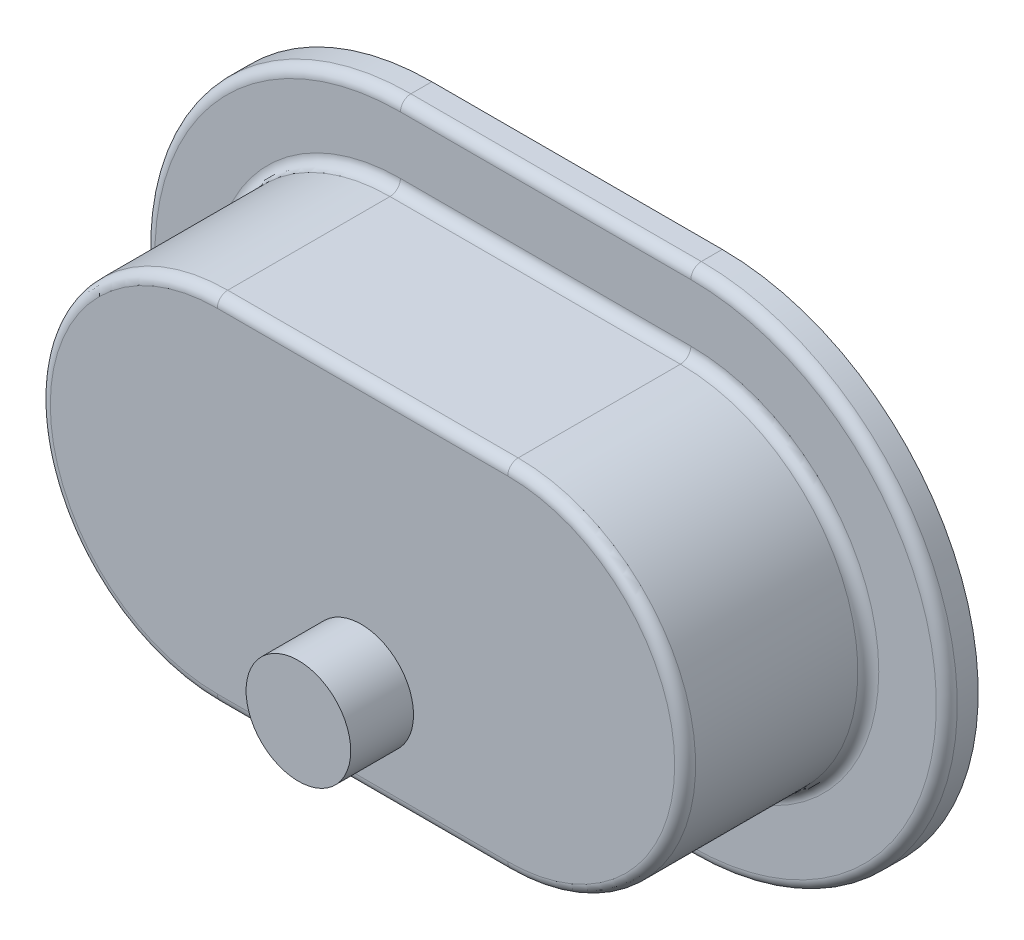
ISO-10303-21;
HEADER;
FILE_DESCRIPTION(('STEP AP214'),'2;1');
FILE_NAME('part.step','',(''),(''),'','','');
FILE_SCHEMA(('AUTOMOTIVE_DESIGN { 1 0 10303 214 1 1 1 1 }'));
ENDSEC;
DATA;
#1=APPLICATION_CONTEXT('core data for automotive mechanical design processes');
#2=APPLICATION_PROTOCOL_DEFINITION('international standard','automotive_design',2000,#1);
#3=PRODUCT_CONTEXT('',#1,'mechanical');
#4=PRODUCT('Part','Part','',(#3));
#5=PRODUCT_RELATED_PRODUCT_CATEGORY('part','',(#4));
#6=PRODUCT_DEFINITION_FORMATION('','',#4);
#7=PRODUCT_DEFINITION_CONTEXT('part definition',#1,'design');
#8=PRODUCT_DEFINITION('design','',#6,#7);
#9=PRODUCT_DEFINITION_SHAPE('','',#8);
#10=(LENGTH_UNIT() NAMED_UNIT(*) SI_UNIT(.MILLI.,.METRE.));
#11=(NAMED_UNIT(*) PLANE_ANGLE_UNIT() SI_UNIT($,.RADIAN.));
#12=(NAMED_UNIT(*) SI_UNIT($,.STERADIAN.) SOLID_ANGLE_UNIT());
#13=UNCERTAINTY_MEASURE_WITH_UNIT(LENGTH_MEASURE(1.E-05),#10,'distance_accuracy_value','');
#14=(GEOMETRIC_REPRESENTATION_CONTEXT(3) GLOBAL_UNCERTAINTY_ASSIGNED_CONTEXT((#13)) GLOBAL_UNIT_ASSIGNED_CONTEXT((#10,
#11,#12)) REPRESENTATION_CONTEXT('',''));
#15=CARTESIAN_POINT('',(0.,0.,0.));
#16=DIRECTION('',(0.,0.,1.));
#17=DIRECTION('',(1.,0.,0.));
#18=AXIS2_PLACEMENT_3D('',#15,#16,#17);
#19=CARTESIAN_POINT('',(-27.4999999999999,90.5,6.));
#20=DIRECTION('',(0.,0.,-1.));
#21=DIRECTION('',(-1.,0.,0.));
#22=AXIS2_PLACEMENT_3D('',#19,#20,#21);
#23=CYLINDRICAL_SURFACE('',#22,48.9085956407228);
#24=DIRECTION('',(0.,0.,-1.));
#25=VECTOR('',#24,1.);
#26=CARTESIAN_POINT('',(-27.4999999999999,41.5914043592772,6.));
#27=LINE('',#26,#25);
#28=CARTESIAN_POINT('',(-27.4999999999999,41.5914043592772,4.));
#29=VERTEX_POINT('',#28);
#30=CARTESIAN_POINT('',(-27.4999999999999,41.5914043592772,0.));
#31=VERTEX_POINT('',#30);
#32=EDGE_CURVE('E371',#29,#31,#27,.T.);
#33=ORIENTED_EDGE('',*,*,#32,.F.);
#34=CARTESIAN_POINT('',(-27.4999999999999,90.5,4.));
#35=DIRECTION('',(0.,0.,1.));
#36=DIRECTION('',(1.,0.,0.));
#37=AXIS2_PLACEMENT_3D('',#34,#35,#36);
#38=CIRCLE('',#37,48.9085956407228);
#39=CARTESIAN_POINT('',(-27.4999999999999,139.408595640723,4.));
#40=VERTEX_POINT('',#39);
#41=EDGE_CURVE('E424',#29,#40,#38,.F.);
#42=ORIENTED_EDGE('',*,*,#41,.T.);
#43=DIRECTION('',(0.,0.,-1.));
#44=VECTOR('',#43,1.);
#45=CARTESIAN_POINT('',(-27.4999999999999,139.408595640723,6.));
#46=LINE('',#45,#44);
#47=CARTESIAN_POINT('',(-27.4999999999999,139.408595640723,0.));
#48=VERTEX_POINT('',#47);
#49=EDGE_CURVE('E362',#40,#48,#46,.T.);
#50=ORIENTED_EDGE('',*,*,#49,.T.);
#51=CARTESIAN_POINT('',(-27.4999999999999,90.5,0.));
#52=DIRECTION('',(0.,0.,1.));
#53=DIRECTION('',(1.,0.,0.));
#54=AXIS2_PLACEMENT_3D('',#51,#52,#53);
#55=CIRCLE('',#54,48.9085956407228);
#56=EDGE_CURVE('E346',#48,#31,#55,.T.);
#57=ORIENTED_EDGE('',*,*,#56,.T.);
#58=EDGE_LOOP('',(#33,#42,#50,#57));
#59=FACE_BOUND('',#58,.T.);
#60=ADVANCED_FACE('F39',(#59),#23,.T.);
#61=CARTESIAN_POINT('',(-27.4999999999999,41.5914043592772,6.));
#62=DIRECTION('',(0.,1.,0.));
#63=DIRECTION('',(-1.,0.,0.));
#64=AXIS2_PLACEMENT_3D('',#61,#62,#63);
#65=PLANE('',#64);
#66=DIRECTION('',(0.,0.,-1.));
#67=VECTOR('',#66,1.);
#68=CARTESIAN_POINT('',(27.9999999999998,41.5914043592773,6.));
#69=LINE('',#68,#67);
#70=CARTESIAN_POINT('',(27.9999999999998,41.5914043592773,4.));
#71=VERTEX_POINT('',#70);
#72=CARTESIAN_POINT('',(27.9999999999998,41.5914043592773,0.));
#73=VERTEX_POINT('',#72);
#74=EDGE_CURVE('E368',#71,#73,#69,.T.);
#75=ORIENTED_EDGE('',*,*,#74,.F.);
#76=DIRECTION('',(1.,0.,0.));
#77=VECTOR('',#76,1.);
#78=CARTESIAN_POINT('',(-27.4999999999999,41.5914043592772,4.));
#79=LINE('',#78,#77);
#80=EDGE_CURVE('E420',#71,#29,#79,.F.);
#81=ORIENTED_EDGE('',*,*,#80,.T.);
#82=ORIENTED_EDGE('',*,*,#32,.T.);
#83=DIRECTION('',(1.,0.,0.));
#84=VECTOR('',#83,1.);
#85=CARTESIAN_POINT('',(-27.4999999999999,41.5914043592772,0.));
#86=LINE('',#85,#84);
#87=EDGE_CURVE('E350',#31,#73,#86,.T.);
#88=ORIENTED_EDGE('',*,*,#87,.T.);
#89=EDGE_LOOP('',(#75,#81,#82,#88));
#90=FACE_BOUND('',#89,.T.);
#91=ADVANCED_FACE('F545',(#90),#65,.F.);
#92=CARTESIAN_POINT('',(27.9999999999998,90.5000000000001,6.));
#93=DIRECTION('',(0.,0.,-1.));
#94=DIRECTION('',(-1.,0.,0.));
#95=AXIS2_PLACEMENT_3D('',#92,#93,#94);
#96=CYLINDRICAL_SURFACE('',#95,48.9085956407228);
#97=DIRECTION('',(0.,0.,-1.));
#98=VECTOR('',#97,1.);
#99=CARTESIAN_POINT('',(27.9999999999998,139.408595640723,6.));
#100=LINE('',#99,#98);
#101=CARTESIAN_POINT('',(27.9999999999998,139.408595640723,4.));
#102=VERTEX_POINT('',#101);
#103=CARTESIAN_POINT('',(27.9999999999998,139.408595640723,0.));
#104=VERTEX_POINT('',#103);
#105=EDGE_CURVE('E365',#102,#104,#100,.T.);
#106=ORIENTED_EDGE('',*,*,#105,.F.);
#107=CARTESIAN_POINT('',(27.9999999999998,90.5000000000001,4.));
#108=DIRECTION('',(0.,0.,1.));
#109=DIRECTION('',(1.,0.,0.));
#110=AXIS2_PLACEMENT_3D('',#107,#108,#109);
#111=CIRCLE('',#110,48.9085956407228);
#112=EDGE_CURVE('E11',#102,#71,#111,.F.);
#113=ORIENTED_EDGE('',*,*,#112,.T.);
#114=ORIENTED_EDGE('',*,*,#74,.T.);
#115=CARTESIAN_POINT('',(27.9999999999998,90.5000000000001,0.));
#116=DIRECTION('',(0.,0.,1.));
#117=DIRECTION('',(1.,0.,0.));
#118=AXIS2_PLACEMENT_3D('',#115,#116,#117);
#119=CIRCLE('',#118,48.9085956407228);
#120=EDGE_CURVE('E354',#73,#104,#119,.T.);
#121=ORIENTED_EDGE('',*,*,#120,.T.);
#122=EDGE_LOOP('',(#106,#113,#114,#121));
#123=FACE_BOUND('',#122,.T.);
#124=ADVANCED_FACE('F551',(#123),#96,.T.);
#125=CARTESIAN_POINT('',(-27.4999999999999,139.408595640723,6.));
#126=DIRECTION('',(0.,-1.,0.));
#127=DIRECTION('',(0.,0.,-1.));
#128=AXIS2_PLACEMENT_3D('',#125,#126,#127);
#129=PLANE('',#128);
#130=ORIENTED_EDGE('',*,*,#49,.F.);
#131=DIRECTION('',(-1.,0.,0.));
#132=VECTOR('',#131,1.);
#133=CARTESIAN_POINT('',(27.9999999999998,139.408595640723,4.));
#134=LINE('',#133,#132);
#135=EDGE_CURVE('E427',#40,#102,#134,.F.);
#136=ORIENTED_EDGE('',*,*,#135,.T.);
#137=ORIENTED_EDGE('',*,*,#105,.T.);
#138=DIRECTION('',(-1.,0.,0.));
#139=VECTOR('',#138,1.);
#140=CARTESIAN_POINT('',(-27.4999999999999,139.408595640723,0.));
#141=LINE('',#140,#139);
#142=EDGE_CURVE('E358',#104,#48,#141,.T.);
#143=ORIENTED_EDGE('',*,*,#142,.T.);
#144=EDGE_LOOP('',(#130,#136,#137,#143));
#145=FACE_BOUND('',#144,.T.);
#146=ADVANCED_FACE('F646',(#145),#129,.F.);
#147=CARTESIAN_POINT('',(-27.4999999999999,90.5,6.));
#148=DIRECTION('',(0.,0.,1.));
#149=DIRECTION('',(1.,0.,0.));
#150=AXIS2_PLACEMENT_3D('',#147,#148,#149);
#151=PLANE('',#150);
#152=DIRECTION('',(-1.,0.,0.));
#153=VECTOR('',#152,1.);
#154=CARTESIAN_POINT('',(-27.4999999999999,126.408595640723,6.));
#155=LINE('',#154,#153);
#156=CARTESIAN_POINT('',(-27.4999999999999,126.408595640723,6.));
#157=VERTEX_POINT('',#156);
#158=CARTESIAN_POINT('',(27.9999999999998,126.408595640723,6.));
#159=VERTEX_POINT('',#158);
#160=EDGE_CURVE('E394',#157,#159,#155,.F.);
#161=ORIENTED_EDGE('',*,*,#160,.T.);
#162=CARTESIAN_POINT('',(27.9999999999998,90.5000000000001,6.));
#163=DIRECTION('',(0.,0.,1.));
#164=DIRECTION('',(1.,0.,0.));
#165=AXIS2_PLACEMENT_3D('',#162,#163,#164);
#166=CIRCLE('',#165,35.9085956407228);
#167=CARTESIAN_POINT('',(27.9999999999997,54.5914043592773,6.));
#168=VERTEX_POINT('',#167);
#169=EDGE_CURVE('E403',#159,#168,#166,.F.);
#170=ORIENTED_EDGE('',*,*,#169,.T.);
#171=DIRECTION('',(1.,0.,0.));
#172=VECTOR('',#171,1.);
#173=CARTESIAN_POINT('',(-27.4999999999998,54.5914043592772,6.));
#174=LINE('',#173,#172);
#175=CARTESIAN_POINT('',(-27.4999999999999,54.5914043592772,6.));
#176=VERTEX_POINT('',#175);
#177=EDGE_CURVE('E400',#168,#176,#174,.F.);
#178=ORIENTED_EDGE('',*,*,#177,.T.);
#179=CARTESIAN_POINT('',(-27.4999999999999,90.5,6.));
#180=DIRECTION('',(0.,0.,1.));
#181=DIRECTION('',(1.,0.,0.));
#182=AXIS2_PLACEMENT_3D('',#179,#180,#181);
#183=CIRCLE('',#182,35.9085956407228);
#184=EDGE_CURVE('E397',#176,#157,#183,.F.);
#185=ORIENTED_EDGE('',*,*,#184,.T.);
#186=EDGE_LOOP('',(#161,#170,#178,#185));
#187=FACE_BOUND('',#186,.T.);
#188=CARTESIAN_POINT('',(-27.4999999999999,90.5,6.));
#189=DIRECTION('',(0.,0.,1.));
#190=DIRECTION('',(1.,0.,0.));
#191=AXIS2_PLACEMENT_3D('',#188,#189,#190);
#192=CIRCLE('',#191,46.9085956407228);
#193=CARTESIAN_POINT('',(-27.4999999999999,137.408595640723,6.));
#194=VERTEX_POINT('',#193);
#195=CARTESIAN_POINT('',(-27.4999999999999,43.5914043592772,6.));
#196=VERTEX_POINT('',#195);
#197=EDGE_CURVE('E387',#194,#196,#192,.T.);
#198=ORIENTED_EDGE('',*,*,#197,.T.);
#199=DIRECTION('',(1.,0.,0.));
#200=VECTOR('',#199,1.);
#201=CARTESIAN_POINT('',(27.9999999999998,43.5914043592773,6.));
#202=LINE('',#201,#200);
#203=CARTESIAN_POINT('',(27.9999999999998,43.5914043592773,6.));
#204=VERTEX_POINT('',#203);
#205=EDGE_CURVE('E390',#196,#204,#202,.T.);
#206=ORIENTED_EDGE('',*,*,#205,.T.);
#207=CARTESIAN_POINT('',(27.9999999999998,90.5000000000001,6.));
#208=DIRECTION('',(0.,0.,1.));
#209=DIRECTION('',(1.,0.,0.));
#210=AXIS2_PLACEMENT_3D('',#207,#208,#209);
#211=CIRCLE('',#210,46.9085956407228);
#212=CARTESIAN_POINT('',(27.9999999999998,137.408595640723,6.));
#213=VERTEX_POINT('',#212);
#214=EDGE_CURVE('E381',#204,#213,#211,.T.);
#215=ORIENTED_EDGE('',*,*,#214,.T.);
#216=DIRECTION('',(-1.,0.,0.));
#217=VECTOR('',#216,1.);
#218=CARTESIAN_POINT('',(-27.4999999999999,137.408595640723,6.));
#219=LINE('',#218,#217);
#220=EDGE_CURVE('E384',#213,#194,#219,.T.);
#221=ORIENTED_EDGE('',*,*,#220,.T.);
#222=EDGE_LOOP('',(#198,#206,#215,#221));
#223=FACE_BOUND('',#222,.T.);
#224=ADVANCED_FACE('F639',(#187,#223),#151,.T.);
#225=CARTESIAN_POINT('',(-27.4999999999999,90.5,0.));
#226=DIRECTION('',(0.,0.,1.));
#227=DIRECTION('',(1.,0.,0.));
#228=AXIS2_PLACEMENT_3D('',#225,#226,#227);
#229=PLANE('',#228);
#230=DIRECTION('',(-1.,0.,0.));
#231=VECTOR('',#230,1.);
#232=CARTESIAN_POINT('',(-27.4999999999999,137.408595640723,0.));
#233=LINE('',#232,#231);
#234=CARTESIAN_POINT('',(27.9999999999998,137.408595640723,0.));
#235=VERTEX_POINT('',#234);
#236=CARTESIAN_POINT('',(-27.4999999999999,137.408595640723,0.));
#237=VERTEX_POINT('',#236);
#238=EDGE_CURVE('E243',#235,#237,#233,.T.);
#239=ORIENTED_EDGE('',*,*,#238,.T.);
#240=CARTESIAN_POINT('',(-27.4999999999999,90.5,0.));
#241=DIRECTION('',(0.,0.,1.));
#242=DIRECTION('',(1.,0.,0.));
#243=AXIS2_PLACEMENT_3D('',#240,#241,#242);
#244=CIRCLE('',#243,46.9085956407228);
#245=CARTESIAN_POINT('',(-27.4999999999999,43.5914043592772,0.));
#246=VERTEX_POINT('',#245);
#247=EDGE_CURVE('E284',#237,#246,#244,.T.);
#248=ORIENTED_EDGE('',*,*,#247,.T.);
#249=DIRECTION('',(1.,0.,0.));
#250=VECTOR('',#249,1.);
#251=CARTESIAN_POINT('',(-27.4999999999999,43.5914043592772,0.));
#252=LINE('',#251,#250);
#253=CARTESIAN_POINT('',(27.9999999999998,43.5914043592773,0.));
#254=VERTEX_POINT('',#253);
#255=EDGE_CURVE('E209',#246,#254,#252,.T.);
#256=ORIENTED_EDGE('',*,*,#255,.T.);
#257=CARTESIAN_POINT('',(27.9999999999998,90.5000000000001,0.));
#258=DIRECTION('',(0.,0.,1.));
#259=DIRECTION('',(1.,0.,0.));
#260=AXIS2_PLACEMENT_3D('',#257,#258,#259);
#261=CIRCLE('',#260,46.9085956407228);
#262=EDGE_CURVE('E57',#254,#235,#261,.T.);
#263=ORIENTED_EDGE('',*,*,#262,.T.);
#264=EDGE_LOOP('',(#239,#248,#256,#263));
#265=FACE_BOUND('',#264,.T.);
#266=ORIENTED_EDGE('',*,*,#56,.F.);
#267=ORIENTED_EDGE('',*,*,#142,.F.);
#268=ORIENTED_EDGE('',*,*,#120,.F.);
#269=ORIENTED_EDGE('',*,*,#87,.F.);
#270=EDGE_LOOP('',(#266,#267,#268,#269));
#271=FACE_BOUND('',#270,.T.);
#272=ADVANCED_FACE('F633',(#265,#271),#229,.F.);
#273=CARTESIAN_POINT('',(-27.4999999999999,90.5,41.));
#274=DIRECTION('',(0.,0.,-1.));
#275=DIRECTION('',(-1.,0.,0.));
#276=AXIS2_PLACEMENT_3D('',#273,#274,#275);
#277=CYLINDRICAL_SURFACE('',#276,33.9085956407228);
#278=DIRECTION('',(0.,0.,-1.));
#279=VECTOR('',#278,1.);
#280=CARTESIAN_POINT('',(-27.4999999999999,124.408595640723,41.));
#281=LINE('',#280,#279);
#282=CARTESIAN_POINT('',(-27.4999999999999,124.408595640723,39.));
#283=VERTEX_POINT('',#282);
#284=CARTESIAN_POINT('',(-27.4999999999999,124.408595640723,8.));
#285=VERTEX_POINT('',#284);
#286=EDGE_CURVE('E329',#283,#285,#281,.T.);
#287=ORIENTED_EDGE('',*,*,#286,.T.);
#288=CARTESIAN_POINT('',(-27.4999999999999,90.5,8.));
#289=DIRECTION('',(0.,0.,1.));
#290=DIRECTION('',(1.,0.,0.));
#291=AXIS2_PLACEMENT_3D('',#288,#289,#290);
#292=CIRCLE('',#291,33.9085956407228);
#293=CARTESIAN_POINT('',(-27.4999999999999,56.5914043592772,8.));
#294=VERTEX_POINT('',#293);
#295=EDGE_CURVE('E417',#285,#294,#292,.T.);
#296=ORIENTED_EDGE('',*,*,#295,.T.);
#297=DIRECTION('',(0.,0.,-1.));
#298=VECTOR('',#297,1.);
#299=CARTESIAN_POINT('',(-27.4999999999999,56.5914043592772,41.));
#300=LINE('',#299,#298);
#301=CARTESIAN_POINT('',(-27.4999999999999,56.5914043592772,39.));
#302=VERTEX_POINT('',#301);
#303=EDGE_CURVE('E342',#302,#294,#300,.T.);
#304=ORIENTED_EDGE('',*,*,#303,.F.);
#305=CARTESIAN_POINT('',(-27.4999999999999,90.5,39.));
#306=DIRECTION('',(0.,0.,1.));
#307=DIRECTION('',(1.,0.,0.));
#308=AXIS2_PLACEMENT_3D('',#305,#306,#307);
#309=CIRCLE('',#308,33.9085956407228);
#310=EDGE_CURVE('E414',#302,#283,#309,.F.);
#311=ORIENTED_EDGE('',*,*,#310,.T.);
#312=EDGE_LOOP('',(#287,#296,#304,#311));
#313=FACE_BOUND('',#312,.T.);
#314=ADVANCED_FACE('F513',(#313),#277,.T.);
#315=CARTESIAN_POINT('',(-27.4999999999999,56.5914043592772,41.));
#316=DIRECTION('',(0.,1.,0.));
#317=DIRECTION('',(-1.,0.,0.));
#318=AXIS2_PLACEMENT_3D('',#315,#316,#317);
#319=PLANE('',#318);
#320=ORIENTED_EDGE('',*,*,#303,.T.);
#321=DIRECTION('',(1.,0.,0.));
#322=VECTOR('',#321,1.);
#323=CARTESIAN_POINT('',(-27.4999999999999,56.5914043592772,8.));
#324=LINE('',#323,#322);
#325=CARTESIAN_POINT('',(27.9999999999997,56.5914043592773,8.));
#326=VERTEX_POINT('',#325);
#327=EDGE_CURVE('E411',#294,#326,#324,.T.);
#328=ORIENTED_EDGE('',*,*,#327,.T.);
#329=DIRECTION('',(0.,0.,-1.));
#330=VECTOR('',#329,1.);
#331=CARTESIAN_POINT('',(27.9999999999997,56.5914043592773,41.));
#332=LINE('',#331,#330);
#333=CARTESIAN_POINT('',(27.9999999999997,56.5914043592773,39.));
#334=VERTEX_POINT('',#333);
#335=EDGE_CURVE('E338',#334,#326,#332,.T.);
#336=ORIENTED_EDGE('',*,*,#335,.F.);
#337=DIRECTION('',(1.,0.,0.));
#338=VECTOR('',#337,1.);
#339=CARTESIAN_POINT('',(-27.4999999999999,56.5914043592772,39.));
#340=LINE('',#339,#338);
#341=EDGE_CURVE('E407',#334,#302,#340,.F.);
#342=ORIENTED_EDGE('',*,*,#341,.T.);
#343=EDGE_LOOP('',(#320,#328,#336,#342));
#344=FACE_BOUND('',#343,.T.);
#345=ADVANCED_FACE('F523',(#344),#319,.F.);
#346=CARTESIAN_POINT('',(27.9999999999998,90.5000000000001,41.));
#347=DIRECTION('',(0.,0.,-1.));
#348=DIRECTION('',(-1.,0.,0.));
#349=AXIS2_PLACEMENT_3D('',#346,#347,#348);
#350=CYLINDRICAL_SURFACE('',#349,33.9085956407228);
#351=ORIENTED_EDGE('',*,*,#335,.T.);
#352=CARTESIAN_POINT('',(27.9999999999998,90.5000000000001,8.));
#353=DIRECTION('',(0.,0.,1.));
#354=DIRECTION('',(1.,0.,0.));
#355=AXIS2_PLACEMENT_3D('',#352,#353,#354);
#356=CIRCLE('',#355,33.9085956407228);
#357=CARTESIAN_POINT('',(27.9999999999998,124.408595640723,8.));
#358=VERTEX_POINT('',#357);
#359=EDGE_CURVE('E377',#326,#358,#356,.T.);
#360=ORIENTED_EDGE('',*,*,#359,.T.);
#361=DIRECTION('',(0.,0.,-1.));
#362=VECTOR('',#361,1.);
#363=CARTESIAN_POINT('',(27.9999999999998,124.408595640723,41.));
#364=LINE('',#363,#362);
#365=CARTESIAN_POINT('',(27.9999999999998,124.408595640723,39.));
#366=VERTEX_POINT('',#365);
#367=EDGE_CURVE('E333',#366,#358,#364,.T.);
#368=ORIENTED_EDGE('',*,*,#367,.F.);
#369=CARTESIAN_POINT('',(27.9999999999998,90.5000000000001,39.));
#370=DIRECTION('',(0.,0.,1.));
#371=DIRECTION('',(1.,0.,0.));
#372=AXIS2_PLACEMENT_3D('',#369,#370,#371);
#373=CIRCLE('',#372,33.9085956407228);
#374=EDGE_CURVE('E374',#366,#334,#373,.F.);
#375=ORIENTED_EDGE('',*,*,#374,.T.);
#376=EDGE_LOOP('',(#351,#360,#368,#375));
#377=FACE_BOUND('',#376,.T.);
#378=ADVANCED_FACE('F497',(#377),#350,.T.);
#379=CARTESIAN_POINT('',(27.9999999999998,124.408595640723,41.));
#380=DIRECTION('',(0.,-1.,0.));
#381=DIRECTION('',(0.,0.,-1.));
#382=AXIS2_PLACEMENT_3D('',#379,#380,#381);
#383=PLANE('',#382);
#384=ORIENTED_EDGE('',*,*,#286,.F.);
#385=DIRECTION('',(-1.,0.,0.));
#386=VECTOR('',#385,1.);
#387=CARTESIAN_POINT('',(27.9999999999998,124.408595640723,39.));
#388=LINE('',#387,#386);
#389=EDGE_CURVE('E49',#283,#366,#388,.F.);
#390=ORIENTED_EDGE('',*,*,#389,.T.);
#391=ORIENTED_EDGE('',*,*,#367,.T.);
#392=DIRECTION('',(-1.,0.,0.));
#393=VECTOR('',#392,1.);
#394=CARTESIAN_POINT('',(27.9999999999998,124.408595640723,8.));
#395=LINE('',#394,#393);
#396=EDGE_CURVE('E440',#358,#285,#395,.T.);
#397=ORIENTED_EDGE('',*,*,#396,.T.);
#398=EDGE_LOOP('',(#384,#390,#391,#397));
#399=FACE_BOUND('',#398,.T.);
#400=ADVANCED_FACE('F495',(#399),#383,.F.);
#401=CARTESIAN_POINT('',(-27.4999999999999,90.5,41.));
#402=DIRECTION('',(0.,0.,1.));
#403=DIRECTION('',(1.,0.,0.));
#404=AXIS2_PLACEMENT_3D('',#401,#402,#403);
#405=PLANE('',#404);
#406=CARTESIAN_POINT('',(0.,73.8826492690237,41.));
#407=DIRECTION('',(0.,0.,1.));
#408=DIRECTION('',(1.,0.,0.));
#409=AXIS2_PLACEMENT_3D('',#406,#407,#408);
#410=CIRCLE('',#409,10.);
#411=CARTESIAN_POINT('',(10.,73.8826492690237,41.));
#412=VERTEX_POINT('',#411);
#413=EDGE_CURVE('E928',#412,#412,#410,.T.);
#414=ORIENTED_EDGE('',*,*,#413,.F.);
#415=EDGE_LOOP('',(#414));
#416=FACE_BOUND('',#415,.T.);
#417=CARTESIAN_POINT('',(-27.4999999999999,90.5,41.));
#418=DIRECTION('',(0.,0.,1.));
#419=DIRECTION('',(1.,0.,0.));
#420=AXIS2_PLACEMENT_3D('',#417,#418,#419);
#421=CIRCLE('',#420,31.9085956407228);
#422=CARTESIAN_POINT('',(-27.4999999999999,122.408595640723,41.));
#423=VERTEX_POINT('',#422);
#424=CARTESIAN_POINT('',(-27.4999999999999,58.5914043592772,41.));
#425=VERTEX_POINT('',#424);
#426=EDGE_CURVE('E65',#423,#425,#421,.T.);
#427=ORIENTED_EDGE('',*,*,#426,.T.);
#428=DIRECTION('',(1.,0.,0.));
#429=VECTOR('',#428,1.);
#430=CARTESIAN_POINT('',(27.9999999999997,58.5914043592773,41.));
#431=LINE('',#430,#429);
#432=CARTESIAN_POINT('',(27.9999999999997,58.5914043592773,41.));
#433=VERTEX_POINT('',#432);
#434=EDGE_CURVE('E438',#425,#433,#431,.T.);
#435=ORIENTED_EDGE('',*,*,#434,.T.);
#436=CARTESIAN_POINT('',(27.9999999999998,90.5000000000001,41.));
#437=DIRECTION('',(0.,0.,1.));
#438=DIRECTION('',(1.,0.,0.));
#439=AXIS2_PLACEMENT_3D('',#436,#437,#438);
#440=CIRCLE('',#439,31.9085956407228);
#441=CARTESIAN_POINT('',(27.9999999999998,122.408595640723,41.));
#442=VERTEX_POINT('',#441);
#443=EDGE_CURVE('E430',#433,#442,#440,.T.);
#444=ORIENTED_EDGE('',*,*,#443,.T.);
#445=DIRECTION('',(-1.,0.,0.));
#446=VECTOR('',#445,1.);
#447=CARTESIAN_POINT('',(-27.4999999999999,122.408595640723,41.));
#448=LINE('',#447,#446);
#449=EDGE_CURVE('E433',#442,#423,#448,.T.);
#450=ORIENTED_EDGE('',*,*,#449,.T.);
#451=EDGE_LOOP('',(#427,#435,#444,#450));
#452=FACE_BOUND('',#451,.T.);
#453=ADVANCED_FACE('F530',(#416,#452),#405,.T.);
#454=CARTESIAN_POINT('',(-27.4999999999999,90.5,8.));
#455=DIRECTION('',(0.,0.,1.));
#456=DIRECTION('',(1.,0.,0.));
#457=AXIS2_PLACEMENT_3D('',#454,#455,#456);
#458=TOROIDAL_SURFACE('',#457,35.9085956407228,2.);
#459=CARTESIAN_POINT('',(-27.4999999999999,126.408595640723,8.));
#460=DIRECTION('',(-1.,0.,0.));
#461=DIRECTION('',(0.,0.,1.));
#462=AXIS2_PLACEMENT_3D('',#459,#460,#461);
#463=CIRCLE('',#462,2.);
#464=EDGE_CURVE('E452',#157,#285,#463,.T.);
#465=ORIENTED_EDGE('',*,*,#464,.F.);
#466=ORIENTED_EDGE('',*,*,#184,.F.);
#467=CARTESIAN_POINT('',(-27.4999999999999,54.5914043592772,8.));
#468=DIRECTION('',(-1.,0.,0.));
#469=DIRECTION('',(0.,0.,1.));
#470=AXIS2_PLACEMENT_3D('',#467,#468,#469);
#471=CIRCLE('',#470,2.);
#472=EDGE_CURVE('E334',#294,#176,#471,.T.);
#473=ORIENTED_EDGE('',*,*,#472,.F.);
#474=ORIENTED_EDGE('',*,*,#295,.F.);
#475=EDGE_LOOP('',(#465,#466,#473,#474));
#476=FACE_BOUND('',#475,.T.);
#477=ADVANCED_FACE('F517',(#476),#458,.F.);
#478=CARTESIAN_POINT('',(-27.4999999999999,54.5914043592772,8.));
#479=DIRECTION('',(1.,0.,0.));
#480=DIRECTION('',(0.,1.,0.));
#481=AXIS2_PLACEMENT_3D('',#478,#479,#480);
#482=CYLINDRICAL_SURFACE('',#481,2.);
#483=ORIENTED_EDGE('',*,*,#472,.T.);
#484=ORIENTED_EDGE('',*,*,#177,.F.);
#485=CARTESIAN_POINT('',(27.9999999999998,54.5914043592773,8.));
#486=DIRECTION('',(-1.,0.,0.));
#487=DIRECTION('',(0.,0.,1.));
#488=AXIS2_PLACEMENT_3D('',#485,#486,#487);
#489=CIRCLE('',#488,2.);
#490=EDGE_CURVE('E448',#326,#168,#489,.T.);
#491=ORIENTED_EDGE('',*,*,#490,.F.);
#492=ORIENTED_EDGE('',*,*,#327,.F.);
#493=EDGE_LOOP('',(#483,#484,#491,#492));
#494=FACE_BOUND('',#493,.T.);
#495=ADVANCED_FACE('F521',(#494),#482,.F.);
#496=CARTESIAN_POINT('',(27.9999999999998,126.408595640723,8.));
#497=DIRECTION('',(-1.,0.,0.));
#498=DIRECTION('',(0.,0.,1.));
#499=AXIS2_PLACEMENT_3D('',#496,#497,#498);
#500=CYLINDRICAL_SURFACE('',#499,2.);
#501=ORIENTED_EDGE('',*,*,#464,.T.);
#502=ORIENTED_EDGE('',*,*,#396,.F.);
#503=CARTESIAN_POINT('',(27.9999999999998,126.408595640723,8.));
#504=DIRECTION('',(-1.,0.,0.));
#505=DIRECTION('',(0.,0.,1.));
#506=AXIS2_PLACEMENT_3D('',#503,#504,#505);
#507=CIRCLE('',#506,2.);
#508=EDGE_CURVE('E445',#159,#358,#507,.T.);
#509=ORIENTED_EDGE('',*,*,#508,.F.);
#510=ORIENTED_EDGE('',*,*,#160,.F.);
#511=EDGE_LOOP('',(#501,#502,#509,#510));
#512=FACE_BOUND('',#511,.T.);
#513=ADVANCED_FACE('F509',(#512),#500,.F.);
#514=CARTESIAN_POINT('',(27.9999999999998,90.5000000000001,8.));
#515=DIRECTION('',(0.,0.,1.));
#516=DIRECTION('',(1.,0.,0.));
#517=AXIS2_PLACEMENT_3D('',#514,#515,#516);
#518=TOROIDAL_SURFACE('',#517,35.9085956407228,2.);
#519=ORIENTED_EDGE('',*,*,#490,.T.);
#520=ORIENTED_EDGE('',*,*,#169,.F.);
#521=ORIENTED_EDGE('',*,*,#508,.T.);
#522=ORIENTED_EDGE('',*,*,#359,.F.);
#523=EDGE_LOOP('',(#519,#520,#521,#522));
#524=FACE_BOUND('',#523,.T.);
#525=ADVANCED_FACE('F502',(#524),#518,.F.);
#526=CARTESIAN_POINT('',(-27.4999999999999,137.408595640723,4.));
#527=DIRECTION('',(1.,0.,0.));
#528=DIRECTION('',(0.,0.,-1.));
#529=AXIS2_PLACEMENT_3D('',#526,#527,#528);
#530=CYLINDRICAL_SURFACE('',#529,2.);
#531=CARTESIAN_POINT('',(27.9999999999998,137.408595640723,4.));
#532=DIRECTION('',(1.,0.,0.));
#533=DIRECTION('',(0.,0.,-1.));
#534=AXIS2_PLACEMENT_3D('',#531,#532,#533);
#535=CIRCLE('',#534,2.);
#536=EDGE_CURVE('E465',#102,#213,#535,.T.);
#537=ORIENTED_EDGE('',*,*,#536,.F.);
#538=ORIENTED_EDGE('',*,*,#135,.F.);
#539=CARTESIAN_POINT('',(-27.4999999999999,137.408595640723,4.));
#540=DIRECTION('',(-1.,0.,0.));
#541=DIRECTION('',(0.,0.,1.));
#542=AXIS2_PLACEMENT_3D('',#539,#540,#541);
#543=CIRCLE('',#542,2.);
#544=EDGE_CURVE('E449',#194,#40,#543,.T.);
#545=ORIENTED_EDGE('',*,*,#544,.F.);
#546=ORIENTED_EDGE('',*,*,#220,.F.);
#547=EDGE_LOOP('',(#537,#538,#545,#546));
#548=FACE_BOUND('',#547,.T.);
#549=ADVANCED_FACE('F559',(#548),#530,.T.);
#550=CARTESIAN_POINT('',(-27.4999999999999,90.5,4.));
#551=DIRECTION('',(0.,0.,1.));
#552=DIRECTION('',(1.,0.,0.));
#553=AXIS2_PLACEMENT_3D('',#550,#551,#552);
#554=TOROIDAL_SURFACE('',#553,46.9085956407228,2.);
#555=ORIENTED_EDGE('',*,*,#544,.T.);
#556=ORIENTED_EDGE('',*,*,#41,.F.);
#557=CARTESIAN_POINT('',(-27.4999999999999,43.5914043592772,4.));
#558=DIRECTION('',(1.,0.,0.));
#559=DIRECTION('',(0.,1.,0.));
#560=AXIS2_PLACEMENT_3D('',#557,#558,#559);
#561=CIRCLE('',#560,2.);
#562=EDGE_CURVE('E462',#196,#29,#561,.T.);
#563=ORIENTED_EDGE('',*,*,#562,.F.);
#564=ORIENTED_EDGE('',*,*,#197,.F.);
#565=EDGE_LOOP('',(#555,#556,#563,#564));
#566=FACE_BOUND('',#565,.T.);
#567=ADVANCED_FACE('F571',(#566),#554,.T.);
#568=CARTESIAN_POINT('',(27.9999999999998,90.5000000000001,4.));
#569=DIRECTION('',(0.,0.,1.));
#570=DIRECTION('',(1.,0.,0.));
#571=AXIS2_PLACEMENT_3D('',#568,#569,#570);
#572=TOROIDAL_SURFACE('',#571,46.9085956407228,2.);
#573=ORIENTED_EDGE('',*,*,#536,.T.);
#574=ORIENTED_EDGE('',*,*,#214,.F.);
#575=CARTESIAN_POINT('',(27.9999999999998,43.5914043592773,4.));
#576=DIRECTION('',(-1.,0.,0.));
#577=DIRECTION('',(0.,0.,1.));
#578=AXIS2_PLACEMENT_3D('',#575,#576,#577);
#579=CIRCLE('',#578,2.);
#580=EDGE_CURVE('E459',#71,#204,#579,.T.);
#581=ORIENTED_EDGE('',*,*,#580,.F.);
#582=ORIENTED_EDGE('',*,*,#112,.F.);
#583=EDGE_LOOP('',(#573,#574,#581,#582));
#584=FACE_BOUND('',#583,.T.);
#585=ADVANCED_FACE('F567',(#584),#572,.T.);
#586=CARTESIAN_POINT('',(-27.4999999999998,43.5914043592772,4.));
#587=DIRECTION('',(-1.,0.,0.));
#588=DIRECTION('',(0.,-1.,0.));
#589=AXIS2_PLACEMENT_3D('',#586,#587,#588);
#590=CYLINDRICAL_SURFACE('',#589,2.);
#591=ORIENTED_EDGE('',*,*,#562,.T.);
#592=ORIENTED_EDGE('',*,*,#80,.F.);
#593=ORIENTED_EDGE('',*,*,#580,.T.);
#594=ORIENTED_EDGE('',*,*,#205,.F.);
#595=EDGE_LOOP('',(#591,#592,#593,#594));
#596=FACE_BOUND('',#595,.T.);
#597=ADVANCED_FACE('F564',(#596),#590,.T.);
#598=CARTESIAN_POINT('',(-27.4999999999999,122.408595640723,39.));
#599=DIRECTION('',(1.,0.,0.));
#600=DIRECTION('',(0.,0.,-1.));
#601=AXIS2_PLACEMENT_3D('',#598,#599,#600);
#602=CYLINDRICAL_SURFACE('',#601,2.);
#603=CARTESIAN_POINT('',(27.9999999999998,122.408595640723,39.));
#604=DIRECTION('',(1.,0.,0.));
#605=DIRECTION('',(0.,0.,-1.));
#606=AXIS2_PLACEMENT_3D('',#603,#604,#605);
#607=CIRCLE('',#606,2.);
#608=EDGE_CURVE('E476',#366,#442,#607,.T.);
#609=ORIENTED_EDGE('',*,*,#608,.F.);
#610=ORIENTED_EDGE('',*,*,#389,.F.);
#611=CARTESIAN_POINT('',(-27.4999999999999,122.408595640723,39.));
#612=DIRECTION('',(-1.,0.,0.));
#613=DIRECTION('',(0.,0.,1.));
#614=AXIS2_PLACEMENT_3D('',#611,#612,#613);
#615=CIRCLE('',#614,2.);
#616=EDGE_CURVE('E43',#423,#283,#615,.T.);
#617=ORIENTED_EDGE('',*,*,#616,.F.);
#618=ORIENTED_EDGE('',*,*,#449,.F.);
#619=EDGE_LOOP('',(#609,#610,#617,#618));
#620=FACE_BOUND('',#619,.T.);
#621=ADVANCED_FACE('F41',(#620),#602,.T.);
#622=CARTESIAN_POINT('',(-27.4999999999999,90.5,39.));
#623=DIRECTION('',(0.,0.,1.));
#624=DIRECTION('',(1.,0.,0.));
#625=AXIS2_PLACEMENT_3D('',#622,#623,#624);
#626=TOROIDAL_SURFACE('',#625,31.9085956407228,2.);
#627=ORIENTED_EDGE('',*,*,#616,.T.);
#628=ORIENTED_EDGE('',*,*,#310,.F.);
#629=CARTESIAN_POINT('',(-27.4999999999999,58.5914043592772,39.));
#630=DIRECTION('',(1.,0.,0.));
#631=DIRECTION('',(0.,1.,0.));
#632=AXIS2_PLACEMENT_3D('',#629,#630,#631);
#633=CIRCLE('',#632,2.);
#634=EDGE_CURVE('E474',#425,#302,#633,.T.);
#635=ORIENTED_EDGE('',*,*,#634,.F.);
#636=ORIENTED_EDGE('',*,*,#426,.F.);
#637=EDGE_LOOP('',(#627,#628,#635,#636));
#638=FACE_BOUND('',#637,.T.);
#639=ADVANCED_FACE('F488',(#638),#626,.T.);
#640=CARTESIAN_POINT('',(27.9999999999998,90.5000000000001,39.));
#641=DIRECTION('',(0.,0.,1.));
#642=DIRECTION('',(1.,0.,0.));
#643=AXIS2_PLACEMENT_3D('',#640,#641,#642);
#644=TOROIDAL_SURFACE('',#643,31.9085956407228,2.);
#645=ORIENTED_EDGE('',*,*,#608,.T.);
#646=ORIENTED_EDGE('',*,*,#443,.F.);
#647=CARTESIAN_POINT('',(27.9999999999998,58.5914043592773,39.));
#648=DIRECTION('',(-1.,0.,0.));
#649=DIRECTION('',(0.,0.,1.));
#650=AXIS2_PLACEMENT_3D('',#647,#648,#649);
#651=CIRCLE('',#650,2.);
#652=EDGE_CURVE('E311',#334,#433,#651,.T.);
#653=ORIENTED_EDGE('',*,*,#652,.F.);
#654=ORIENTED_EDGE('',*,*,#374,.F.);
#655=EDGE_LOOP('',(#645,#646,#653,#654));
#656=FACE_BOUND('',#655,.T.);
#657=ADVANCED_FACE('F529',(#656),#644,.T.);
#658=CARTESIAN_POINT('',(-27.4999999999998,58.5914043592772,39.));
#659=DIRECTION('',(-1.,0.,0.));
#660=DIRECTION('',(0.,-1.,0.));
#661=AXIS2_PLACEMENT_3D('',#658,#659,#660);
#662=CYLINDRICAL_SURFACE('',#661,2.);
#663=ORIENTED_EDGE('',*,*,#634,.T.);
#664=ORIENTED_EDGE('',*,*,#341,.F.);
#665=ORIENTED_EDGE('',*,*,#652,.T.);
#666=ORIENTED_EDGE('',*,*,#434,.F.);
#667=EDGE_LOOP('',(#663,#664,#665,#666));
#668=FACE_BOUND('',#667,.T.);
#669=ADVANCED_FACE('F527',(#668),#662,.T.);
#670=CARTESIAN_POINT('',(-27.4999999999999,90.5,6.));
#671=DIRECTION('',(0.,0.,-1.));
#672=DIRECTION('',(-1.,0.,0.));
#673=AXIS2_PLACEMENT_3D('',#670,#671,#672);
#674=CYLINDRICAL_SURFACE('',#673,46.9085956407228);
#675=DIRECTION('',(0.,0.,1.));
#676=VECTOR('',#675,1.);
#677=CARTESIAN_POINT('',(-27.4999999999999,43.5914043592772,6.));
#678=LINE('',#677,#676);
#679=CARTESIAN_POINT('',(-27.4999999999999,43.5914043592772,4.));
#680=VERTEX_POINT('',#679);
#681=EDGE_CURVE('E203',#680,#246,#678,.F.);
#682=ORIENTED_EDGE('',*,*,#681,.T.);
#683=ORIENTED_EDGE('',*,*,#247,.F.);
#684=DIRECTION('',(0.,0.,-1.));
#685=VECTOR('',#684,1.);
#686=CARTESIAN_POINT('',(-27.4999999999999,137.408595640723,6.));
#687=LINE('',#686,#685);
#688=CARTESIAN_POINT('',(-27.4999999999999,137.408595640723,4.));
#689=VERTEX_POINT('',#688);
#690=EDGE_CURVE('E229',#689,#237,#687,.T.);
#691=ORIENTED_EDGE('',*,*,#690,.F.);
#692=CARTESIAN_POINT('',(-27.4999999999999,90.5,4.));
#693=DIRECTION('',(0.,0.,1.));
#694=DIRECTION('',(1.,0.,0.));
#695=AXIS2_PLACEMENT_3D('',#692,#693,#694);
#696=CIRCLE('',#695,46.9085956407228);
#697=EDGE_CURVE('E222',#680,#689,#696,.F.);
#698=ORIENTED_EDGE('',*,*,#697,.F.);
#699=EDGE_LOOP('',(#682,#683,#691,#698));
#700=FACE_BOUND('',#699,.T.);
#701=ADVANCED_FACE('F228',(#700),#674,.F.);
#702=CARTESIAN_POINT('',(-27.4999999999999,43.5914043592772,6.));
#703=DIRECTION('',(0.,1.,0.));
#704=DIRECTION('',(-1.,0.,0.));
#705=AXIS2_PLACEMENT_3D('',#702,#703,#704);
#706=PLANE('',#705);
#707=DIRECTION('',(0.,0.,-1.));
#708=VECTOR('',#707,1.);
#709=CARTESIAN_POINT('',(27.9999999999998,43.5914043592773,6.));
#710=LINE('',#709,#708);
#711=CARTESIAN_POINT('',(27.9999999999998,43.5914043592773,4.));
#712=VERTEX_POINT('',#711);
#713=EDGE_CURVE('E216',#712,#254,#710,.T.);
#714=ORIENTED_EDGE('',*,*,#713,.T.);
#715=ORIENTED_EDGE('',*,*,#255,.F.);
#716=ORIENTED_EDGE('',*,*,#681,.F.);
#717=DIRECTION('',(-1.,0.,0.));
#718=VECTOR('',#717,1.);
#719=CARTESIAN_POINT('',(-27.4999999999998,43.5914043592772,4.));
#720=LINE('',#719,#718);
#721=EDGE_CURVE('E206',#712,#680,#720,.T.);
#722=ORIENTED_EDGE('',*,*,#721,.F.);
#723=EDGE_LOOP('',(#714,#715,#716,#722));
#724=FACE_BOUND('',#723,.T.);
#725=ADVANCED_FACE('F205',(#724),#706,.T.);
#726=CARTESIAN_POINT('',(27.9999999999998,90.5000000000001,6.));
#727=DIRECTION('',(0.,0.,-1.));
#728=DIRECTION('',(-1.,0.,0.));
#729=AXIS2_PLACEMENT_3D('',#726,#727,#728);
#730=CYLINDRICAL_SURFACE('',#729,46.9085956407228);
#731=DIRECTION('',(0.,0.,-1.));
#732=VECTOR('',#731,1.);
#733=CARTESIAN_POINT('',(27.9999999999998,137.408595640723,6.));
#734=LINE('',#733,#732);
#735=CARTESIAN_POINT('',(27.9999999999998,137.408595640723,4.));
#736=VERTEX_POINT('',#735);
#737=EDGE_CURVE('E242',#736,#235,#734,.T.);
#738=ORIENTED_EDGE('',*,*,#737,.T.);
#739=ORIENTED_EDGE('',*,*,#262,.F.);
#740=ORIENTED_EDGE('',*,*,#713,.F.);
#741=CARTESIAN_POINT('',(27.9999999999998,90.5000000000001,4.));
#742=DIRECTION('',(0.,0.,1.));
#743=DIRECTION('',(1.,0.,0.));
#744=AXIS2_PLACEMENT_3D('',#741,#742,#743);
#745=CIRCLE('',#744,46.9085956407228);
#746=EDGE_CURVE('E224',#712,#736,#745,.T.);
#747=ORIENTED_EDGE('',*,*,#746,.T.);
#748=EDGE_LOOP('',(#738,#739,#740,#747));
#749=FACE_BOUND('',#748,.T.);
#750=ADVANCED_FACE('F773',(#749),#730,.F.);
#751=CARTESIAN_POINT('',(-27.4999999999999,137.408595640723,6.));
#752=DIRECTION('',(0.,-1.,0.));
#753=DIRECTION('',(0.,0.,-1.));
#754=AXIS2_PLACEMENT_3D('',#751,#752,#753);
#755=PLANE('',#754);
#756=ORIENTED_EDGE('',*,*,#690,.T.);
#757=ORIENTED_EDGE('',*,*,#238,.F.);
#758=ORIENTED_EDGE('',*,*,#737,.F.);
#759=DIRECTION('',(1.,0.,0.));
#760=VECTOR('',#759,1.);
#761=CARTESIAN_POINT('',(-27.4999999999999,137.408595640723,4.));
#762=LINE('',#761,#760);
#763=EDGE_CURVE('E231',#689,#736,#762,.T.);
#764=ORIENTED_EDGE('',*,*,#763,.F.);
#765=EDGE_LOOP('',(#756,#757,#758,#764));
#766=FACE_BOUND('',#765,.T.);
#767=ADVANCED_FACE('F782',(#766),#755,.T.);
#768=CARTESIAN_POINT('',(-27.4999999999999,90.5,4.));
#769=DIRECTION('',(0.,0.,1.));
#770=DIRECTION('',(1.,0.,0.));
#771=AXIS2_PLACEMENT_3D('',#768,#769,#770);
#772=PLANE('',#771);
#773=DIRECTION('',(1.,0.,0.));
#774=VECTOR('',#773,1.);
#775=CARTESIAN_POINT('',(-27.4999999999999,126.408595640723,4.));
#776=LINE('',#775,#774);
#777=CARTESIAN_POINT('',(-27.4999999999999,126.408595640723,4.));
#778=VERTEX_POINT('',#777);
#779=CARTESIAN_POINT('',(27.9999999999998,126.408595640723,4.));
#780=VERTEX_POINT('',#779);
#781=EDGE_CURVE('E249',#778,#780,#776,.T.);
#782=ORIENTED_EDGE('',*,*,#781,.F.);
#783=CARTESIAN_POINT('',(-27.4999999999999,90.5,4.));
#784=DIRECTION('',(0.,0.,1.));
#785=DIRECTION('',(1.,0.,0.));
#786=AXIS2_PLACEMENT_3D('',#783,#784,#785);
#787=CIRCLE('',#786,35.9085956407228);
#788=CARTESIAN_POINT('',(-27.4999999999999,54.5914043592772,4.));
#789=VERTEX_POINT('',#788);
#790=EDGE_CURVE('E253',#789,#778,#787,.F.);
#791=ORIENTED_EDGE('',*,*,#790,.F.);
#792=DIRECTION('',(1.,0.,0.));
#793=VECTOR('',#792,1.);
#794=CARTESIAN_POINT('',(-27.4999999999999,54.5914043592773,4.));
#795=LINE('',#794,#793);
#796=CARTESIAN_POINT('',(27.9999999999997,54.5914043592773,4.));
#797=VERTEX_POINT('',#796);
#798=EDGE_CURVE('E259',#797,#789,#795,.F.);
#799=ORIENTED_EDGE('',*,*,#798,.F.);
#800=CARTESIAN_POINT('',(27.9999999999998,90.5000000000001,4.));
#801=DIRECTION('',(0.,0.,1.));
#802=DIRECTION('',(1.,0.,0.));
#803=AXIS2_PLACEMENT_3D('',#800,#801,#802);
#804=CIRCLE('',#803,35.9085956407228);
#805=EDGE_CURVE('E254',#780,#797,#804,.F.);
#806=ORIENTED_EDGE('',*,*,#805,.F.);
#807=EDGE_LOOP('',(#782,#791,#799,#806));
#808=FACE_BOUND('',#807,.T.);
#809=ORIENTED_EDGE('',*,*,#697,.T.);
#810=ORIENTED_EDGE('',*,*,#763,.T.);
#811=ORIENTED_EDGE('',*,*,#746,.F.);
#812=ORIENTED_EDGE('',*,*,#721,.T.);
#813=EDGE_LOOP('',(#809,#810,#811,#812));
#814=FACE_BOUND('',#813,.T.);
#815=ADVANCED_FACE('F220',(#808,#814),#772,.F.);
#816=CARTESIAN_POINT('',(-27.4999999999999,90.5,41.));
#817=DIRECTION('',(0.,0.,-1.));
#818=DIRECTION('',(-1.,0.,0.));
#819=AXIS2_PLACEMENT_3D('',#816,#817,#818);
#820=CYLINDRICAL_SURFACE('',#819,31.9085956407228);
#821=DIRECTION('',(0.,0.,-1.));
#822=VECTOR('',#821,1.);
#823=CARTESIAN_POINT('',(-27.4999999999999,122.408595640723,41.));
#824=LINE('',#823,#822);
#825=CARTESIAN_POINT('',(-27.4999999999999,122.408595640723,39.));
#826=VERTEX_POINT('',#825);
#827=CARTESIAN_POINT('',(-27.4999999999999,122.408595640723,8.));
#828=VERTEX_POINT('',#827);
#829=EDGE_CURVE('E272',#826,#828,#824,.T.);
#830=ORIENTED_EDGE('',*,*,#829,.F.);
#831=CARTESIAN_POINT('',(-27.4999999999999,90.5,39.));
#832=DIRECTION('',(0.,0.,1.));
#833=DIRECTION('',(1.,0.,0.));
#834=AXIS2_PLACEMENT_3D('',#831,#832,#833);
#835=CIRCLE('',#834,31.9085956407228);
#836=CARTESIAN_POINT('',(-27.4999999999999,58.5914043592772,39.));
#837=VERTEX_POINT('',#836);
#838=EDGE_CURVE('E275',#837,#826,#835,.F.);
#839=ORIENTED_EDGE('',*,*,#838,.F.);
#840=DIRECTION('',(0.,0.,1.));
#841=VECTOR('',#840,1.);
#842=CARTESIAN_POINT('',(-27.4999999999999,58.5914043592772,41.));
#843=LINE('',#842,#841);
#844=CARTESIAN_POINT('',(-27.4999999999999,58.5914043592772,8.));
#845=VERTEX_POINT('',#844);
#846=EDGE_CURVE('E280',#837,#845,#843,.F.);
#847=ORIENTED_EDGE('',*,*,#846,.T.);
#848=CARTESIAN_POINT('',(-27.4999999999999,90.5,8.));
#849=DIRECTION('',(0.,0.,-1.));
#850=DIRECTION('',(-1.,0.,0.));
#851=AXIS2_PLACEMENT_3D('',#848,#849,#850);
#852=CIRCLE('',#851,31.9085956407228);
#853=EDGE_CURVE('E226',#828,#845,#852,.F.);
#854=ORIENTED_EDGE('',*,*,#853,.F.);
#855=EDGE_LOOP('',(#830,#839,#847,#854));
#856=FACE_BOUND('',#855,.T.);
#857=ADVANCED_FACE('F800',(#856),#820,.F.);
#858=CARTESIAN_POINT('',(-27.4999999999999,58.5914043592772,41.));
#859=DIRECTION('',(0.,1.,0.));
#860=DIRECTION('',(-1.,0.,0.));
#861=AXIS2_PLACEMENT_3D('',#858,#859,#860);
#862=PLANE('',#861);
#863=ORIENTED_EDGE('',*,*,#846,.F.);
#864=DIRECTION('',(-1.,0.,0.));
#865=VECTOR('',#864,1.);
#866=CARTESIAN_POINT('',(-27.4999999999998,58.5914043592772,39.));
#867=LINE('',#866,#865);
#868=CARTESIAN_POINT('',(27.9999999999998,58.5914043592773,39.));
#869=VERTEX_POINT('',#868);
#870=EDGE_CURVE('E258',#869,#837,#867,.T.);
#871=ORIENTED_EDGE('',*,*,#870,.F.);
#872=DIRECTION('',(0.,0.,-1.));
#873=VECTOR('',#872,1.);
#874=CARTESIAN_POINT('',(27.9999999999998,58.5914043592773,41.));
#875=LINE('',#874,#873);
#876=CARTESIAN_POINT('',(27.9999999999997,58.5914043592773,8.));
#877=VERTEX_POINT('',#876);
#878=EDGE_CURVE('E285',#869,#877,#875,.T.);
#879=ORIENTED_EDGE('',*,*,#878,.T.);
#880=DIRECTION('',(-1.,0.,0.));
#881=VECTOR('',#880,1.);
#882=CARTESIAN_POINT('',(-27.4999999999999,58.5914043592772,8.));
#883=LINE('',#882,#881);
#884=EDGE_CURVE('E289',#845,#877,#883,.F.);
#885=ORIENTED_EDGE('',*,*,#884,.F.);
#886=EDGE_LOOP('',(#863,#871,#879,#885));
#887=FACE_BOUND('',#886,.T.);
#888=ADVANCED_FACE('F810',(#887),#862,.T.);
#889=CARTESIAN_POINT('',(27.9999999999998,90.5000000000001,41.));
#890=DIRECTION('',(0.,0.,-1.));
#891=DIRECTION('',(-1.,0.,0.));
#892=AXIS2_PLACEMENT_3D('',#889,#890,#891);
#893=CYLINDRICAL_SURFACE('',#892,31.9085956407228);
#894=ORIENTED_EDGE('',*,*,#878,.F.);
#895=CARTESIAN_POINT('',(27.9999999999998,90.5000000000001,39.));
#896=DIRECTION('',(0.,0.,1.));
#897=DIRECTION('',(1.,0.,0.));
#898=AXIS2_PLACEMENT_3D('',#895,#896,#897);
#899=CIRCLE('',#898,31.9085956407228);
#900=CARTESIAN_POINT('',(27.9999999999998,122.408595640723,39.));
#901=VERTEX_POINT('',#900);
#902=EDGE_CURVE('E236',#869,#901,#899,.T.);
#903=ORIENTED_EDGE('',*,*,#902,.T.);
#904=DIRECTION('',(0.,0.,-1.));
#905=VECTOR('',#904,1.);
#906=CARTESIAN_POINT('',(27.9999999999998,122.408595640723,41.));
#907=LINE('',#906,#905);
#908=CARTESIAN_POINT('',(27.9999999999998,122.408595640723,8.));
#909=VERTEX_POINT('',#908);
#910=EDGE_CURVE('E279',#901,#909,#907,.T.);
#911=ORIENTED_EDGE('',*,*,#910,.T.);
#912=CARTESIAN_POINT('',(27.9999999999998,90.5000000000001,8.));
#913=DIRECTION('',(0.,0.,-1.));
#914=DIRECTION('',(-1.,0.,0.));
#915=AXIS2_PLACEMENT_3D('',#912,#913,#914);
#916=CIRCLE('',#915,31.9085956407228);
#917=EDGE_CURVE('E215',#877,#909,#916,.F.);
#918=ORIENTED_EDGE('',*,*,#917,.F.);
#919=EDGE_LOOP('',(#894,#903,#911,#918));
#920=FACE_BOUND('',#919,.T.);
#921=ADVANCED_FACE('F820',(#920),#893,.F.);
#922=CARTESIAN_POINT('',(27.9999999999998,122.408595640723,41.));
#923=DIRECTION('',(0.,-1.,0.));
#924=DIRECTION('',(0.,0.,-1.));
#925=AXIS2_PLACEMENT_3D('',#922,#923,#924);
#926=PLANE('',#925);
#927=ORIENTED_EDGE('',*,*,#829,.T.);
#928=DIRECTION('',(1.,0.,0.));
#929=VECTOR('',#928,1.);
#930=CARTESIAN_POINT('',(27.9999999999998,122.408595640723,8.));
#931=LINE('',#930,#929);
#932=EDGE_CURVE('E306',#909,#828,#931,.F.);
#933=ORIENTED_EDGE('',*,*,#932,.F.);
#934=ORIENTED_EDGE('',*,*,#910,.F.);
#935=DIRECTION('',(1.,0.,0.));
#936=VECTOR('',#935,1.);
#937=CARTESIAN_POINT('',(-27.4999999999999,122.408595640723,39.));
#938=LINE('',#937,#936);
#939=EDGE_CURVE('E307',#826,#901,#938,.T.);
#940=ORIENTED_EDGE('',*,*,#939,.F.);
#941=EDGE_LOOP('',(#927,#933,#934,#940));
#942=FACE_BOUND('',#941,.T.);
#943=ADVANCED_FACE('F830',(#942),#926,.T.);
#944=CARTESIAN_POINT('',(-27.4999999999999,90.5,39.));
#945=DIRECTION('',(0.,0.,1.));
#946=DIRECTION('',(1.,0.,0.));
#947=AXIS2_PLACEMENT_3D('',#944,#945,#946);
#948=PLANE('',#947);
#949=ORIENTED_EDGE('',*,*,#838,.T.);
#950=ORIENTED_EDGE('',*,*,#939,.T.);
#951=ORIENTED_EDGE('',*,*,#902,.F.);
#952=ORIENTED_EDGE('',*,*,#870,.T.);
#953=EDGE_LOOP('',(#949,#950,#951,#952));
#954=FACE_BOUND('',#953,.T.);
#955=ADVANCED_FACE('F840',(#954),#948,.F.);
#956=CARTESIAN_POINT('',(-27.4999999999999,90.5,8.));
#957=DIRECTION('',(0.,0.,1.));
#958=DIRECTION('',(1.,0.,0.));
#959=AXIS2_PLACEMENT_3D('',#956,#957,#958);
#960=TOROIDAL_SURFACE('',#959,35.9085956407228,4.);
#961=CARTESIAN_POINT('',(-27.4999999999999,126.408595640723,8.));
#962=DIRECTION('',(-1.,0.,0.));
#963=DIRECTION('',(0.,0.,1.));
#964=AXIS2_PLACEMENT_3D('',#961,#962,#963);
#965=CIRCLE('',#964,4.);
#966=EDGE_CURVE('E264',#778,#828,#965,.T.);
#967=ORIENTED_EDGE('',*,*,#966,.T.);
#968=ORIENTED_EDGE('',*,*,#853,.T.);
#969=CARTESIAN_POINT('',(-27.4999999999999,54.5914043592772,8.));
#970=DIRECTION('',(1.,0.,0.));
#971=DIRECTION('',(0.,1.,0.));
#972=AXIS2_PLACEMENT_3D('',#969,#970,#971);
#973=CIRCLE('',#972,4.);
#974=EDGE_CURVE('E268',#845,#789,#973,.F.);
#975=ORIENTED_EDGE('',*,*,#974,.T.);
#976=ORIENTED_EDGE('',*,*,#790,.T.);
#977=EDGE_LOOP('',(#967,#968,#975,#976));
#978=FACE_BOUND('',#977,.T.);
#979=ADVANCED_FACE('F850',(#978),#960,.T.);
#980=CARTESIAN_POINT('',(-27.4999999999999,54.5914043592772,8.));
#981=DIRECTION('',(1.,0.,0.));
#982=DIRECTION('',(0.,1.,0.));
#983=AXIS2_PLACEMENT_3D('',#980,#981,#982);
#984=CYLINDRICAL_SURFACE('',#983,4.);
#985=ORIENTED_EDGE('',*,*,#974,.F.);
#986=ORIENTED_EDGE('',*,*,#884,.T.);
#987=CARTESIAN_POINT('',(27.9999999999997,54.5914043592773,8.));
#988=DIRECTION('',(-1.,0.,0.));
#989=DIRECTION('',(0.,-1.,0.));
#990=AXIS2_PLACEMENT_3D('',#987,#988,#989);
#991=CIRCLE('',#990,4.);
#992=EDGE_CURVE('E269',#877,#797,#991,.T.);
#993=ORIENTED_EDGE('',*,*,#992,.T.);
#994=ORIENTED_EDGE('',*,*,#798,.T.);
#995=EDGE_LOOP('',(#985,#986,#993,#994));
#996=FACE_BOUND('',#995,.T.);
#997=ADVANCED_FACE('F860',(#996),#984,.T.);
#998=CARTESIAN_POINT('',(27.9999999999998,126.408595640723,8.));
#999=DIRECTION('',(-1.,0.,0.));
#1000=DIRECTION('',(0.,0.,1.));
#1001=AXIS2_PLACEMENT_3D('',#998,#999,#1000);
#1002=CYLINDRICAL_SURFACE('',#1001,4.);
#1003=ORIENTED_EDGE('',*,*,#966,.F.);
#1004=ORIENTED_EDGE('',*,*,#781,.T.);
#1005=CARTESIAN_POINT('',(27.9999999999998,126.408595640723,8.));
#1006=DIRECTION('',(1.,0.,0.));
#1007=DIRECTION('',(0.,1.,0.));
#1008=AXIS2_PLACEMENT_3D('',#1005,#1006,#1007);
#1009=CIRCLE('',#1008,4.);
#1010=EDGE_CURVE('E314',#780,#909,#1009,.F.);
#1011=ORIENTED_EDGE('',*,*,#1010,.T.);
#1012=ORIENTED_EDGE('',*,*,#932,.T.);
#1013=EDGE_LOOP('',(#1003,#1004,#1011,#1012));
#1014=FACE_BOUND('',#1013,.T.);
#1015=ADVANCED_FACE('F870',(#1014),#1002,.T.);
#1016=CARTESIAN_POINT('',(27.9999999999998,90.5000000000001,8.));
#1017=DIRECTION('',(0.,0.,1.));
#1018=DIRECTION('',(1.,0.,0.));
#1019=AXIS2_PLACEMENT_3D('',#1016,#1017,#1018);
#1020=TOROIDAL_SURFACE('',#1019,35.9085956407228,4.);
#1021=ORIENTED_EDGE('',*,*,#992,.F.);
#1022=ORIENTED_EDGE('',*,*,#917,.T.);
#1023=ORIENTED_EDGE('',*,*,#1010,.F.);
#1024=ORIENTED_EDGE('',*,*,#805,.T.);
#1025=EDGE_LOOP('',(#1021,#1022,#1023,#1024));
#1026=FACE_BOUND('',#1025,.T.);
#1027=ADVANCED_FACE('F880',(#1026),#1020,.T.);
#1028=CARTESIAN_POINT('',(0.,73.8826492690237,53.));
#1029=DIRECTION('',(0.,0.,-1.));
#1030=DIRECTION('',(-1.,0.,0.));
#1031=AXIS2_PLACEMENT_3D('',#1028,#1029,#1030);
#1032=CYLINDRICAL_SURFACE('',#1031,10.);
#1033=CARTESIAN_POINT('',(0.,73.8826492690237,53.));
#1034=DIRECTION('',(0.,0.,1.));
#1035=DIRECTION('',(1.,0.,0.));
#1036=AXIS2_PLACEMENT_3D('',#1033,#1034,#1035);
#1037=CIRCLE('',#1036,10.);
#1038=CARTESIAN_POINT('',(10.,73.8826492690237,53.));
#1039=VERTEX_POINT('',#1038);
#1040=EDGE_CURVE('E317',#1039,#1039,#1037,.T.);
#1041=ORIENTED_EDGE('',*,*,#1040,.F.);
#1042=EDGE_LOOP('',(#1041));
#1043=FACE_BOUND('',#1042,.T.);
#1044=ORIENTED_EDGE('',*,*,#413,.T.);
#1045=EDGE_LOOP('',(#1044));
#1046=FACE_BOUND('',#1045,.T.);
#1047=ADVANCED_FACE('F889',(#1043,#1046),#1032,.T.);
#1048=CARTESIAN_POINT('',(0.,73.8826492690237,53.));
#1049=DIRECTION('',(0.,0.,1.));
#1050=DIRECTION('',(1.,0.,0.));
#1051=AXIS2_PLACEMENT_3D('',#1048,#1049,#1050);
#1052=PLANE('',#1051);
#1053=ORIENTED_EDGE('',*,*,#1040,.T.);
#1054=EDGE_LOOP('',(#1053));
#1055=FACE_BOUND('',#1054,.T.);
#1056=ADVANCED_FACE('F897',(#1055),#1052,.T.);
#1057=CLOSED_SHELL('',(#60,#91,#124,#146,#224,#272,#314,#345,#378,#400,#453,#477,#495,#513,#525,
#549,#567,#585,#597,#621,#639,#657,#669,#701,#725,#750,#767,#815,#857,#888,#921,#943,#955,#979,
#997,#1015,#1027,#1047,#1056));
#1058=MANIFOLD_SOLID_BREP('B2',#1057);
#1059=ADVANCED_BREP_SHAPE_REPRESENTATION('',(#18,#1058),#14);
#1060=SHAPE_DEFINITION_REPRESENTATION(#9,#1059);
ENDSEC;
END-ISO-10303-21;
